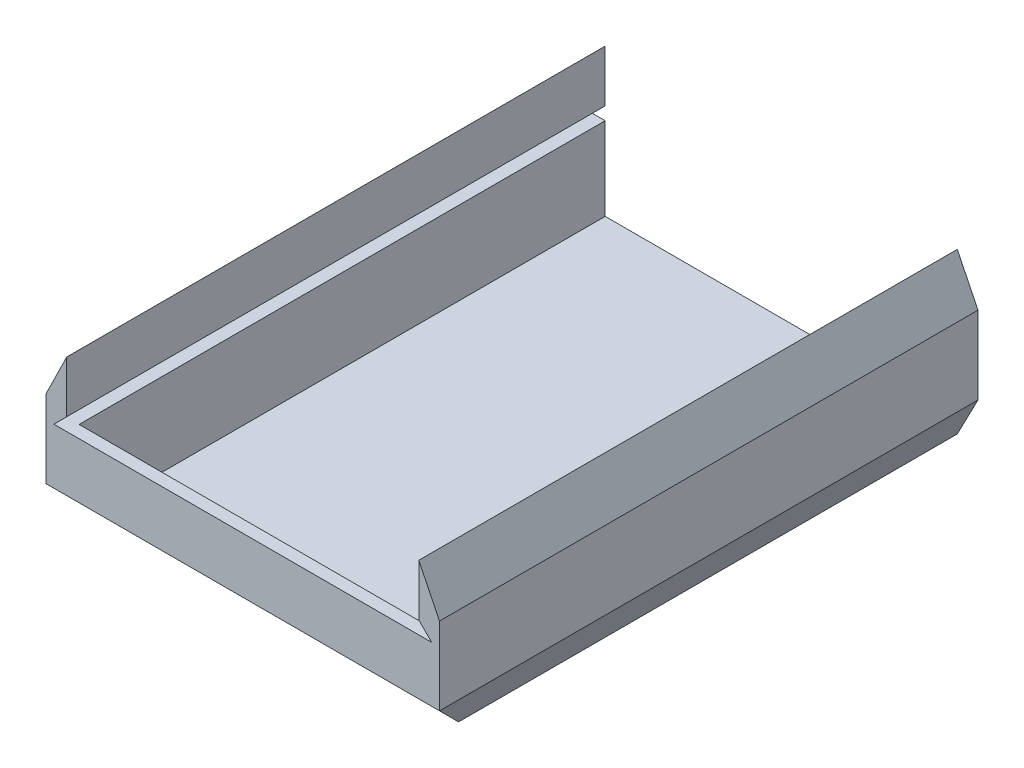
ISO-10303-21;
HEADER;
FILE_DESCRIPTION(('STEP AP214'),'2;1');
FILE_NAME('part.step','',(''),(''),'','','');
FILE_SCHEMA(('AUTOMOTIVE_DESIGN { 1 0 10303 214 1 1 1 1 }'));
ENDSEC;
DATA;
#1=APPLICATION_CONTEXT('core data for automotive mechanical design processes');
#2=APPLICATION_PROTOCOL_DEFINITION('international standard','automotive_design',2000,#1);
#3=PRODUCT_CONTEXT('',#1,'mechanical');
#4=PRODUCT('Part','Part','',(#3));
#5=PRODUCT_RELATED_PRODUCT_CATEGORY('part','',(#4));
#6=PRODUCT_DEFINITION_FORMATION('','',#4);
#7=PRODUCT_DEFINITION_CONTEXT('part definition',#1,'design');
#8=PRODUCT_DEFINITION('design','',#6,#7);
#9=PRODUCT_DEFINITION_SHAPE('','',#8);
#10=(LENGTH_UNIT() NAMED_UNIT(*) SI_UNIT(.MILLI.,.METRE.));
#11=(NAMED_UNIT(*) PLANE_ANGLE_UNIT() SI_UNIT($,.RADIAN.));
#12=(NAMED_UNIT(*) SI_UNIT($,.STERADIAN.) SOLID_ANGLE_UNIT());
#13=UNCERTAINTY_MEASURE_WITH_UNIT(LENGTH_MEASURE(1.E-05),#10,'distance_accuracy_value','');
#14=(GEOMETRIC_REPRESENTATION_CONTEXT(3) GLOBAL_UNCERTAINTY_ASSIGNED_CONTEXT((#13)) GLOBAL_UNIT_ASSIGNED_CONTEXT((#10,
#11,#12)) REPRESENTATION_CONTEXT('',''));
#15=CARTESIAN_POINT('',(0.,0.,0.));
#16=DIRECTION('',(0.,0.,1.));
#17=DIRECTION('',(1.,0.,0.));
#18=AXIS2_PLACEMENT_3D('',#15,#16,#17);
#19=CARTESIAN_POINT('',(0.,38.,-130.));
#20=DIRECTION('',(1.,0.,0.));
#21=DIRECTION('',(0.,1.,0.));
#22=AXIS2_PLACEMENT_3D('',#19,#20,#21);
#23=PLANE('',#22);
#24=DIRECTION('',(0.,-1.,0.));
#25=VECTOR('',#24,1.);
#26=CARTESIAN_POINT('',(0.,23.,-3.));
#27=LINE('',#26,#25);
#28=CARTESIAN_POINT('',(0.,23.,-3.));
#29=VERTEX_POINT('',#28);
#30=CARTESIAN_POINT('',(0.,8.,-3.));
#31=VERTEX_POINT('',#30);
#32=EDGE_CURVE('E195',#29,#31,#27,.T.);
#33=ORIENTED_EDGE('',*,*,#32,.T.);
#34=DIRECTION('',(0.,0.707106781186545,0.70710678118655));
#35=VECTOR('',#34,1.);
#36=CARTESIAN_POINT('',(0.,-40.5000000000001,-51.5000000000005));
#37=LINE('',#36,#35);
#38=CARTESIAN_POINT('',(0.,3.,-8.00000000000004));
#39=VERTEX_POINT('',#38);
#40=EDGE_CURVE('E11',#31,#39,#37,.F.);
#41=ORIENTED_EDGE('',*,*,#40,.T.);
#42=DIRECTION('',(0.,0.,1.));
#43=VECTOR('',#42,1.);
#44=CARTESIAN_POINT('',(0.,3.,0.));
#45=LINE('',#44,#43);
#46=CARTESIAN_POINT('',(0.,3.,-130.));
#47=VERTEX_POINT('',#46);
#48=EDGE_CURVE('E265',#47,#39,#45,.T.);
#49=ORIENTED_EDGE('',*,*,#48,.F.);
#50=DIRECTION('',(0.,1.,0.));
#51=VECTOR('',#50,1.);
#52=CARTESIAN_POINT('',(0.,38.,-130.));
#53=LINE('',#52,#51);
#54=CARTESIAN_POINT('',(0.,23.,-130.));
#55=VERTEX_POINT('',#54);
#56=EDGE_CURVE('E249',#47,#55,#53,.T.);
#57=ORIENTED_EDGE('',*,*,#56,.T.);
#58=DIRECTION('',(0.,0.,1.));
#59=VECTOR('',#58,1.);
#60=CARTESIAN_POINT('',(0.,23.,-130.));
#61=LINE('',#60,#59);
#62=EDGE_CURVE('E210',#55,#29,#61,.T.);
#63=ORIENTED_EDGE('',*,*,#62,.T.);
#64=EDGE_LOOP('',(#33,#41,#49,#57,#63));
#65=FACE_BOUND('',#64,.T.);
#66=ADVANCED_FACE('F33',(#65),#23,.T.);
#67=CARTESIAN_POINT('',(0.,3.,0.));
#68=DIRECTION('',(0.,-1.,0.));
#69=DIRECTION('',(0.,0.,-1.));
#70=AXIS2_PLACEMENT_3D('',#67,#68,#69);
#71=PLANE('',#70);
#72=ORIENTED_EDGE('',*,*,#48,.T.);
#73=DIRECTION('',(1.,0.,0.));
#74=VECTOR('',#73,1.);
#75=CARTESIAN_POINT('',(85.,3.,-8.00000000000004));
#76=LINE('',#75,#74);
#77=CARTESIAN_POINT('',(85.,3.,-8.00000000000004));
#78=VERTEX_POINT('',#77);
#79=EDGE_CURVE('E293',#39,#78,#76,.T.);
#80=ORIENTED_EDGE('',*,*,#79,.T.);
#81=DIRECTION('',(0.,0.,-1.));
#82=VECTOR('',#81,1.);
#83=CARTESIAN_POINT('',(85.,3.,0.));
#84=LINE('',#83,#82);
#85=CARTESIAN_POINT('',(85.,3.,-130.));
#86=VERTEX_POINT('',#85);
#87=EDGE_CURVE('E268',#78,#86,#84,.T.);
#88=ORIENTED_EDGE('',*,*,#87,.T.);
#89=DIRECTION('',(-1.,0.,0.));
#90=VECTOR('',#89,1.);
#91=CARTESIAN_POINT('',(0.,3.,-130.));
#92=LINE('',#91,#90);
#93=EDGE_CURVE('E271',#86,#47,#92,.T.);
#94=ORIENTED_EDGE('',*,*,#93,.T.);
#95=EDGE_LOOP('',(#72,#80,#88,#94));
#96=FACE_BOUND('',#95,.T.);
#97=ADVANCED_FACE('F298',(#96),#71,.F.);
#98=CARTESIAN_POINT('',(85.,38.,-130.));
#99=DIRECTION('',(-1.,0.,0.));
#100=DIRECTION('',(0.,0.,1.));
#101=AXIS2_PLACEMENT_3D('',#98,#99,#100);
#102=PLANE('',#101);
#103=ORIENTED_EDGE('',*,*,#87,.F.);
#104=DIRECTION('',(0.,-0.707106781186545,-0.70710678118655));
#105=VECTOR('',#104,1.);
#106=CARTESIAN_POINT('',(85.,-40.5000000000001,-51.5000000000005));
#107=LINE('',#106,#105);
#108=CARTESIAN_POINT('',(85.,8.,-3.));
#109=VERTEX_POINT('',#108);
#110=EDGE_CURVE('E55',#78,#109,#107,.F.);
#111=ORIENTED_EDGE('',*,*,#110,.T.);
#112=DIRECTION('',(0.,1.,0.));
#113=VECTOR('',#112,1.);
#114=CARTESIAN_POINT('',(85.,23.,-3.));
#115=LINE('',#114,#113);
#116=CARTESIAN_POINT('',(85.,23.,-3.));
#117=VERTEX_POINT('',#116);
#118=EDGE_CURVE('E197',#109,#117,#115,.T.);
#119=ORIENTED_EDGE('',*,*,#118,.T.);
#120=DIRECTION('',(0.,0.,1.));
#121=VECTOR('',#120,1.);
#122=CARTESIAN_POINT('',(85.,23.,-130.));
#123=LINE('',#122,#121);
#124=CARTESIAN_POINT('',(85.,23.,-130.));
#125=VERTEX_POINT('',#124);
#126=EDGE_CURVE('E225',#125,#117,#123,.T.);
#127=ORIENTED_EDGE('',*,*,#126,.F.);
#128=DIRECTION('',(0.,-1.,0.));
#129=VECTOR('',#128,1.);
#130=CARTESIAN_POINT('',(85.,38.,-130.));
#131=LINE('',#130,#129);
#132=EDGE_CURVE('E171',#125,#86,#131,.T.);
#133=ORIENTED_EDGE('',*,*,#132,.T.);
#134=EDGE_LOOP('',(#103,#111,#119,#127,#133));
#135=FACE_BOUND('',#134,.T.);
#136=ADVANCED_FACE('F302',(#135),#102,.T.);
#137=DIRECTION('',(0.,0.,1.));
#138=VECTOR('',#137,1.);
#139=CARTESIAN_POINT('',(85.,26.1,-130.));
#140=LINE('',#139,#138);
#141=CARTESIAN_POINT('',(85.,26.1,-130.));
#142=VERTEX_POINT('',#141);
#143=CARTESIAN_POINT('',(85.,26.1,0.));
#144=VERTEX_POINT('',#143);
#145=EDGE_CURVE('E213',#142,#144,#140,.T.);
#146=ORIENTED_EDGE('',*,*,#145,.T.);
#147=DIRECTION('',(0.,-1.,0.));
#148=VECTOR('',#147,1.);
#149=CARTESIAN_POINT('',(85.,38.,0.));
#150=LINE('',#149,#148);
#151=CARTESIAN_POINT('',(85.,38.6,0.));
#152=VERTEX_POINT('',#151);
#153=EDGE_CURVE('E177',#152,#144,#150,.T.);
#154=ORIENTED_EDGE('',*,*,#153,.F.);
#155=DIRECTION('',(0.,0.,1.));
#156=VECTOR('',#155,1.);
#157=CARTESIAN_POINT('',(85.,38.6,-130.));
#158=LINE('',#157,#156);
#159=CARTESIAN_POINT('',(85.,38.6,-130.));
#160=VERTEX_POINT('',#159);
#161=EDGE_CURVE('E174',#160,#152,#158,.T.);
#162=ORIENTED_EDGE('',*,*,#161,.F.);
#163=EDGE_CURVE('E158',#160,#142,#131,.T.);
#164=ORIENTED_EDGE('',*,*,#163,.T.);
#165=EDGE_LOOP('',(#146,#154,#162,#164));
#166=FACE_BOUND('',#165,.T.);
#167=ADVANCED_FACE('F175',(#166),#102,.T.);
#168=CARTESIAN_POINT('',(0.,3.,0.));
#169=DIRECTION('',(0.,0.,-1.));
#170=DIRECTION('',(-1.,0.,0.));
#171=AXIS2_PLACEMENT_3D('',#168,#169,#170);
#172=PLANE('',#171);
#173=DIRECTION('',(0.,1.,0.));
#174=VECTOR('',#173,1.);
#175=CARTESIAN_POINT('',(90.,9.60906334512409,0.));
#176=LINE('',#175,#174);
#177=CARTESIAN_POINT('',(90.,9.60999999999998,0.));
#178=VERTEX_POINT('',#177);
#179=CARTESIAN_POINT('',(90.,28.3909366548759,0.));
#180=VERTEX_POINT('',#179);
#181=EDGE_CURVE('E218',#178,#180,#176,.T.);
#182=ORIENTED_EDGE('',*,*,#181,.T.);
#183=DIRECTION('',(-0.439842080698515,0.898075132740464,0.));
#184=VECTOR('',#183,1.);
#185=CARTESIAN_POINT('',(85.,38.6,0.));
#186=LINE('',#185,#184);
#187=EDGE_CURVE('E185',#180,#152,#186,.T.);
#188=ORIENTED_EDGE('',*,*,#187,.T.);
#189=ORIENTED_EDGE('',*,*,#153,.T.);
#190=DIRECTION('',(-0.707106781186547,0.707106781186548,0.));
#191=VECTOR('',#190,1.);
#192=CARTESIAN_POINT('',(88.1,23.,0.));
#193=LINE('',#192,#191);
#194=CARTESIAN_POINT('',(88.1,23.,0.));
#195=VERTEX_POINT('',#194);
#196=EDGE_CURVE('E202',#195,#144,#193,.T.);
#197=ORIENTED_EDGE('',*,*,#196,.F.);
#198=DIRECTION('',(1.,0.,0.));
#199=VECTOR('',#198,1.);
#200=CARTESIAN_POINT('',(0.,23.,0.));
#201=LINE('',#200,#199);
#202=CARTESIAN_POINT('',(-3.1,23.,0.));
#203=VERTEX_POINT('',#202);
#204=EDGE_CURVE('E211',#203,#195,#201,.T.);
#205=ORIENTED_EDGE('',*,*,#204,.F.);
#206=DIRECTION('',(-0.707106781186548,-0.707106781186547,0.));
#207=VECTOR('',#206,1.);
#208=CARTESIAN_POINT('',(-3.1,23.,0.));
#209=LINE('',#208,#207);
#210=CARTESIAN_POINT('',(0.,26.1,0.));
#211=VERTEX_POINT('',#210);
#212=EDGE_CURVE('E207',#211,#203,#209,.T.);
#213=ORIENTED_EDGE('',*,*,#212,.F.);
#214=DIRECTION('',(0.,1.,0.));
#215=VECTOR('',#214,1.);
#216=CARTESIAN_POINT('',(0.,38.,0.));
#217=LINE('',#216,#215);
#218=CARTESIAN_POINT('',(0.,38.6,0.));
#219=VERTEX_POINT('',#218);
#220=EDGE_CURVE('E242',#211,#219,#217,.T.);
#221=ORIENTED_EDGE('',*,*,#220,.T.);
#222=DIRECTION('',(-0.439842080698515,-0.898075132740464,0.));
#223=VECTOR('',#222,1.);
#224=CARTESIAN_POINT('',(0.,38.6,0.));
#225=LINE('',#224,#223);
#226=CARTESIAN_POINT('',(-5.,28.3909366548759,0.));
#227=VERTEX_POINT('',#226);
#228=EDGE_CURVE('E180',#219,#227,#225,.T.);
#229=ORIENTED_EDGE('',*,*,#228,.T.);
#230=DIRECTION('',(0.,-1.,0.));
#231=VECTOR('',#230,1.);
#232=CARTESIAN_POINT('',(-5.,9.60906334512409,0.));
#233=LINE('',#232,#231);
#234=CARTESIAN_POINT('',(-5.,9.60999999999998,0.));
#235=VERTEX_POINT('',#234);
#236=EDGE_CURVE('E248',#227,#235,#233,.T.);
#237=ORIENTED_EDGE('',*,*,#236,.T.);
#238=DIRECTION('',(1.,0.,0.));
#239=VECTOR('',#238,1.);
#240=CARTESIAN_POINT('',(85.,9.60999999999998,0.));
#241=LINE('',#240,#239);
#242=EDGE_CURVE('E274',#235,#178,#241,.T.);
#243=ORIENTED_EDGE('',*,*,#242,.T.);
#244=EDGE_LOOP('',(#182,#188,#189,#197,#205,#213,#221,#229,#237,#243));
#245=FACE_BOUND('',#244,.T.);
#246=ADVANCED_FACE('F359',(#245),#172,.F.);
#247=CARTESIAN_POINT('',(0.,3.,-130.));
#248=DIRECTION('',(0.,0.,1.));
#249=DIRECTION('',(1.,0.,0.));
#250=AXIS2_PLACEMENT_3D('',#247,#248,#249);
#251=PLANE('',#250);
#252=DIRECTION('',(-0.707106781186547,0.707106781186548,0.));
#253=VECTOR('',#252,1.);
#254=CARTESIAN_POINT('',(88.1,23.,-130.));
#255=LINE('',#254,#253);
#256=CARTESIAN_POINT('',(88.1,23.,-130.));
#257=VERTEX_POINT('',#256);
#258=EDGE_CURVE('E167',#257,#142,#255,.T.);
#259=ORIENTED_EDGE('',*,*,#258,.T.);
#260=ORIENTED_EDGE('',*,*,#163,.F.);
#261=DIRECTION('',(-0.439842080698515,0.898075132740464,0.));
#262=VECTOR('',#261,1.);
#263=CARTESIAN_POINT('',(85.,38.6,-130.));
#264=LINE('',#263,#262);
#265=CARTESIAN_POINT('',(90.,28.3909366548759,-130.));
#266=VERTEX_POINT('',#265);
#267=EDGE_CURVE('E163',#266,#160,#264,.T.);
#268=ORIENTED_EDGE('',*,*,#267,.F.);
#269=DIRECTION('',(0.,1.,0.));
#270=VECTOR('',#269,1.);
#271=CARTESIAN_POINT('',(90.,9.60906334512409,-130.));
#272=LINE('',#271,#270);
#273=CARTESIAN_POINT('',(90.,9.60906334512409,-130.));
#274=VERTEX_POINT('',#273);
#275=EDGE_CURVE('E236',#274,#266,#272,.T.);
#276=ORIENTED_EDGE('',*,*,#275,.F.);
#277=DIRECTION('',(0.461591586339288,0.887092558542106,0.));
#278=VECTOR('',#277,1.);
#279=CARTESIAN_POINT('',(85.,0.,-130.));
#280=LINE('',#279,#278);
#281=CARTESIAN_POINT('',(85.,0.,-130.));
#282=VERTEX_POINT('',#281);
#283=EDGE_CURVE('E233',#282,#274,#280,.T.);
#284=ORIENTED_EDGE('',*,*,#283,.F.);
#285=DIRECTION('',(-1.,0.,0.));
#286=VECTOR('',#285,1.);
#287=CARTESIAN_POINT('',(0.,0.,-130.));
#288=LINE('',#287,#286);
#289=CARTESIAN_POINT('',(0.,0.,-130.));
#290=VERTEX_POINT('',#289);
#291=EDGE_CURVE('E269',#282,#290,#288,.T.);
#292=ORIENTED_EDGE('',*,*,#291,.T.);
#293=DIRECTION('',(0.461591586339287,-0.887092558542106,0.));
#294=VECTOR('',#293,1.);
#295=CARTESIAN_POINT('',(0.,0.,-130.));
#296=LINE('',#295,#294);
#297=CARTESIAN_POINT('',(-5.,9.60906334512409,-130.));
#298=VERTEX_POINT('',#297);
#299=EDGE_CURVE('E245',#298,#290,#296,.T.);
#300=ORIENTED_EDGE('',*,*,#299,.F.);
#301=DIRECTION('',(0.,-1.,0.));
#302=VECTOR('',#301,1.);
#303=CARTESIAN_POINT('',(-5.,9.60906334512409,-130.));
#304=LINE('',#303,#302);
#305=CARTESIAN_POINT('',(-5.,28.3909366548759,-130.));
#306=VERTEX_POINT('',#305);
#307=EDGE_CURVE('E252',#306,#298,#304,.T.);
#308=ORIENTED_EDGE('',*,*,#307,.F.);
#309=DIRECTION('',(-0.439842080698515,-0.898075132740464,0.));
#310=VECTOR('',#309,1.);
#311=CARTESIAN_POINT('',(0.,38.6,-130.));
#312=LINE('',#311,#310);
#313=CARTESIAN_POINT('',(0.,38.6,-130.));
#314=VERTEX_POINT('',#313);
#315=EDGE_CURVE('E189',#314,#306,#312,.T.);
#316=ORIENTED_EDGE('',*,*,#315,.F.);
#317=CARTESIAN_POINT('',(0.,26.1,-130.));
#318=VERTEX_POINT('',#317);
#319=EDGE_CURVE('E247',#318,#314,#53,.T.);
#320=ORIENTED_EDGE('',*,*,#319,.F.);
#321=DIRECTION('',(-0.707106781186548,-0.707106781186547,0.));
#322=VECTOR('',#321,1.);
#323=CARTESIAN_POINT('',(-3.1,23.,-130.));
#324=LINE('',#323,#322);
#325=CARTESIAN_POINT('',(-3.1,23.,-130.));
#326=VERTEX_POINT('',#325);
#327=EDGE_CURVE('E206',#318,#326,#324,.T.);
#328=ORIENTED_EDGE('',*,*,#327,.T.);
#329=DIRECTION('',(1.,0.,0.));
#330=VECTOR('',#329,1.);
#331=CARTESIAN_POINT('',(0.,23.,-130.));
#332=LINE('',#331,#330);
#333=EDGE_CURVE('E203',#326,#55,#332,.T.);
#334=ORIENTED_EDGE('',*,*,#333,.T.);
#335=ORIENTED_EDGE('',*,*,#56,.F.);
#336=ORIENTED_EDGE('',*,*,#93,.F.);
#337=ORIENTED_EDGE('',*,*,#132,.F.);
#338=DIRECTION('',(1.,0.,0.));
#339=VECTOR('',#338,1.);
#340=CARTESIAN_POINT('',(85.,23.,-130.));
#341=LINE('',#340,#339);
#342=EDGE_CURVE('E222',#125,#257,#341,.T.);
#343=ORIENTED_EDGE('',*,*,#342,.T.);
#344=EDGE_LOOP('',(#259,#260,#268,#276,#284,#292,#300,#308,#316,#320,#328,#334,#335,#336,#337,#343));
#345=FACE_BOUND('',#344,.T.);
#346=ADVANCED_FACE('F160',(#345),#251,.F.);
#347=CARTESIAN_POINT('',(0.,0.,0.));
#348=DIRECTION('',(0.,-1.,0.));
#349=DIRECTION('',(0.,0.,-1.));
#350=AXIS2_PLACEMENT_3D('',#347,#348,#349);
#351=PLANE('',#350);
#352=DIRECTION('',(0.,0.,-1.));
#353=VECTOR('',#352,1.);
#354=CARTESIAN_POINT('',(85.,0.,0.));
#355=LINE('',#354,#353);
#356=CARTESIAN_POINT('',(85.,0.,-9.61000000000001));
#357=VERTEX_POINT('',#356);
#358=EDGE_CURVE('E277',#357,#282,#355,.T.);
#359=ORIENTED_EDGE('',*,*,#358,.F.);
#360=DIRECTION('',(-1.,0.,0.));
#361=VECTOR('',#360,1.);
#362=CARTESIAN_POINT('',(0.,0.,-9.61000000000001));
#363=LINE('',#362,#361);
#364=CARTESIAN_POINT('',(0.,0.,-9.61000000000001));
#365=VERTEX_POINT('',#364);
#366=EDGE_CURVE('E287',#357,#365,#363,.T.);
#367=ORIENTED_EDGE('',*,*,#366,.T.);
#368=DIRECTION('',(0.,0.,1.));
#369=VECTOR('',#368,1.);
#370=CARTESIAN_POINT('',(0.,0.,0.));
#371=LINE('',#370,#369);
#372=EDGE_CURVE('E262',#290,#365,#371,.T.);
#373=ORIENTED_EDGE('',*,*,#372,.F.);
#374=ORIENTED_EDGE('',*,*,#291,.F.);
#375=EDGE_LOOP('',(#359,#367,#373,#374));
#376=FACE_BOUND('',#375,.T.);
#377=ADVANCED_FACE('F332',(#376),#351,.T.);
#378=DIRECTION('',(0.,0.,1.));
#379=VECTOR('',#378,1.);
#380=CARTESIAN_POINT('',(0.,26.1,-130.));
#381=LINE('',#380,#379);
#382=EDGE_CURVE('E219',#318,#211,#381,.T.);
#383=ORIENTED_EDGE('',*,*,#382,.F.);
#384=ORIENTED_EDGE('',*,*,#319,.T.);
#385=DIRECTION('',(0.,0.,1.));
#386=VECTOR('',#385,1.);
#387=CARTESIAN_POINT('',(0.,38.6,-130.));
#388=LINE('',#387,#386);
#389=EDGE_CURVE('E191',#314,#219,#388,.T.);
#390=ORIENTED_EDGE('',*,*,#389,.T.);
#391=ORIENTED_EDGE('',*,*,#220,.F.);
#392=EDGE_LOOP('',(#383,#384,#390,#391));
#393=FACE_BOUND('',#392,.T.);
#394=ADVANCED_FACE('F323',(#393),#23,.T.);
#395=CARTESIAN_POINT('',(0.,0.,-130.));
#396=DIRECTION('',(-0.887092558542106,-0.461591586339287,0.));
#397=DIRECTION('',(0.461591586339287,-0.887092558542106,0.));
#398=AXIS2_PLACEMENT_3D('',#395,#396,#397);
#399=PLANE('',#398);
#400=ORIENTED_EDGE('',*,*,#372,.T.);
#401=DIRECTION('',(-0.3453056816789,0.663612833736761,0.663612833736763));
#402=VECTOR('',#401,1.);
#403=CARTESIAN_POINT('',(27.5872820508712,-53.0175881493253,-62.6275881493254));
#404=LINE('',#403,#402);
#405=CARTESIAN_POINT('',(-5.,9.60906334512409,-0.000936654875882681));
#406=VERTEX_POINT('',#405);
#407=EDGE_CURVE('E289',#365,#406,#404,.T.);
#408=ORIENTED_EDGE('',*,*,#407,.T.);
#409=DIRECTION('',(0.,0.,1.));
#410=VECTOR('',#409,1.);
#411=CARTESIAN_POINT('',(-5.,9.60906334512409,-130.));
#412=LINE('',#411,#410);
#413=EDGE_CURVE('E259',#298,#406,#412,.T.);
#414=ORIENTED_EDGE('',*,*,#413,.F.);
#415=ORIENTED_EDGE('',*,*,#299,.T.);
#416=EDGE_LOOP('',(#400,#408,#414,#415));
#417=FACE_BOUND('',#416,.T.);
#418=ADVANCED_FACE('F331',(#417),#399,.T.);
#419=CARTESIAN_POINT('',(-5.,9.60906334512409,-130.));
#420=DIRECTION('',(-1.,0.,0.));
#421=DIRECTION('',(0.,-1.,0.));
#422=AXIS2_PLACEMENT_3D('',#419,#420,#421);
#423=PLANE('',#422);
#424=ORIENTED_EDGE('',*,*,#413,.T.);
#425=DIRECTION('',(0.,0.707106781186547,0.707106781186549));
#426=VECTOR('',#425,1.);
#427=CARTESIAN_POINT('',(-4.99999999999999,-55.390468327438,-65.0004683274381));
#428=LINE('',#427,#426);
#429=EDGE_CURVE('E291',#406,#235,#428,.T.);
#430=ORIENTED_EDGE('',*,*,#429,.T.);
#431=ORIENTED_EDGE('',*,*,#236,.F.);
#432=DIRECTION('',(0.,0.,1.));
#433=VECTOR('',#432,1.);
#434=CARTESIAN_POINT('',(-5.,28.3909366548759,-130.));
#435=LINE('',#434,#433);
#436=EDGE_CURVE('E255',#306,#227,#435,.T.);
#437=ORIENTED_EDGE('',*,*,#436,.F.);
#438=ORIENTED_EDGE('',*,*,#307,.T.);
#439=EDGE_LOOP('',(#424,#430,#431,#437,#438));
#440=FACE_BOUND('',#439,.T.);
#441=ADVANCED_FACE('F338',(#440),#423,.T.);
#442=CARTESIAN_POINT('',(85.,0.,-130.));
#443=DIRECTION('',(0.887092558542106,-0.461591586339288,0.));
#444=DIRECTION('',(0.461591586339288,0.887092558542106,0.));
#445=AXIS2_PLACEMENT_3D('',#442,#443,#444);
#446=PLANE('',#445);
#447=DIRECTION('',(0.,0.,1.));
#448=VECTOR('',#447,1.);
#449=CARTESIAN_POINT('',(90.,9.60906334512409,-130.));
#450=LINE('',#449,#448);
#451=CARTESIAN_POINT('',(90.,9.60906334512409,-0.000936654875882681));
#452=VERTEX_POINT('',#451);
#453=EDGE_CURVE('E170',#274,#452,#450,.T.);
#454=ORIENTED_EDGE('',*,*,#453,.T.);
#455=DIRECTION('',(-0.3453056816789,-0.663612833736761,-0.663612833736763));
#456=VECTOR('',#455,1.);
#457=CARTESIAN_POINT('',(57.4127179491288,-53.0175881493252,-62.6275881493254));
#458=LINE('',#457,#456);
#459=EDGE_CURVE('E285',#452,#357,#458,.T.);
#460=ORIENTED_EDGE('',*,*,#459,.T.);
#461=ORIENTED_EDGE('',*,*,#358,.T.);
#462=ORIENTED_EDGE('',*,*,#283,.T.);
#463=EDGE_LOOP('',(#454,#460,#461,#462));
#464=FACE_BOUND('',#463,.T.);
#465=ADVANCED_FACE('F367',(#464),#446,.T.);
#466=CARTESIAN_POINT('',(90.,9.60906334512409,-130.));
#467=DIRECTION('',(1.,0.,0.));
#468=DIRECTION('',(0.,0.,-1.));
#469=AXIS2_PLACEMENT_3D('',#466,#467,#468);
#470=PLANE('',#469);
#471=ORIENTED_EDGE('',*,*,#181,.F.);
#472=DIRECTION('',(0.,-0.707106781186547,-0.707106781186549));
#473=VECTOR('',#472,1.);
#474=CARTESIAN_POINT('',(90.,-55.390468327438,-65.0004683274381));
#475=LINE('',#474,#473);
#476=EDGE_CURVE('E283',#178,#452,#475,.T.);
#477=ORIENTED_EDGE('',*,*,#476,.T.);
#478=ORIENTED_EDGE('',*,*,#453,.F.);
#479=ORIENTED_EDGE('',*,*,#275,.T.);
#480=DIRECTION('',(0.,0.,1.));
#481=VECTOR('',#480,1.);
#482=CARTESIAN_POINT('',(90.,28.3909366548759,-130.));
#483=LINE('',#482,#481);
#484=EDGE_CURVE('E184',#266,#180,#483,.T.);
#485=ORIENTED_EDGE('',*,*,#484,.T.);
#486=EDGE_LOOP('',(#471,#477,#478,#479,#485));
#487=FACE_BOUND('',#486,.T.);
#488=ADVANCED_FACE('F365',(#487),#470,.T.);
#489=CARTESIAN_POINT('',(88.1,23.,-130.));
#490=DIRECTION('',(0.707106781186548,0.707106781186547,0.));
#491=DIRECTION('',(-0.707106781186547,0.707106781186548,0.));
#492=AXIS2_PLACEMENT_3D('',#489,#490,#491);
#493=PLANE('',#492);
#494=ORIENTED_EDGE('',*,*,#196,.T.);
#495=ORIENTED_EDGE('',*,*,#145,.F.);
#496=ORIENTED_EDGE('',*,*,#258,.F.);
#497=DIRECTION('',(0.,0.,1.));
#498=VECTOR('',#497,1.);
#499=CARTESIAN_POINT('',(88.1,23.,-130.));
#500=LINE('',#499,#498);
#501=EDGE_CURVE('E228',#257,#195,#500,.T.);
#502=ORIENTED_EDGE('',*,*,#501,.T.);
#503=EDGE_LOOP('',(#494,#495,#496,#502));
#504=FACE_BOUND('',#503,.T.);
#505=ADVANCED_FACE('F379',(#504),#493,.F.);
#506=CARTESIAN_POINT('',(0.,23.,-130.));
#507=DIRECTION('',(0.,-1.,0.));
#508=DIRECTION('',(0.,0.,-1.));
#509=AXIS2_PLACEMENT_3D('',#506,#507,#508);
#510=PLANE('',#509);
#511=ORIENTED_EDGE('',*,*,#204,.T.);
#512=ORIENTED_EDGE('',*,*,#501,.F.);
#513=ORIENTED_EDGE('',*,*,#342,.F.);
#514=ORIENTED_EDGE('',*,*,#126,.T.);
#515=DIRECTION('',(-1.,0.,0.));
#516=VECTOR('',#515,1.);
#517=CARTESIAN_POINT('',(0.,23.,-3.));
#518=LINE('',#517,#516);
#519=EDGE_CURVE('E199',#117,#29,#518,.T.);
#520=ORIENTED_EDGE('',*,*,#519,.T.);
#521=ORIENTED_EDGE('',*,*,#62,.F.);
#522=ORIENTED_EDGE('',*,*,#333,.F.);
#523=DIRECTION('',(0.,0.,1.));
#524=VECTOR('',#523,1.);
#525=CARTESIAN_POINT('',(-3.1,23.,-130.));
#526=LINE('',#525,#524);
#527=EDGE_CURVE('E216',#326,#203,#526,.T.);
#528=ORIENTED_EDGE('',*,*,#527,.T.);
#529=EDGE_LOOP('',(#511,#512,#513,#514,#520,#521,#522,#528));
#530=FACE_BOUND('',#529,.T.);
#531=ADVANCED_FACE('F387',(#530),#510,.F.);
#532=CARTESIAN_POINT('',(-3.1,23.,-130.));
#533=DIRECTION('',(-0.707106781186547,0.707106781186548,0.));
#534=DIRECTION('',(-0.707106781186548,-0.707106781186547,0.));
#535=AXIS2_PLACEMENT_3D('',#532,#533,#534);
#536=PLANE('',#535);
#537=ORIENTED_EDGE('',*,*,#212,.T.);
#538=ORIENTED_EDGE('',*,*,#527,.F.);
#539=ORIENTED_EDGE('',*,*,#327,.F.);
#540=ORIENTED_EDGE('',*,*,#382,.T.);
#541=EDGE_LOOP('',(#537,#538,#539,#540));
#542=FACE_BOUND('',#541,.T.);
#543=ADVANCED_FACE('F391',(#542),#536,.F.);
#544=CARTESIAN_POINT('',(0.,0.,-3.));
#545=DIRECTION('',(0.,0.,1.));
#546=DIRECTION('',(1.,0.,0.));
#547=AXIS2_PLACEMENT_3D('',#544,#545,#546);
#548=PLANE('',#547);
#549=ORIENTED_EDGE('',*,*,#118,.F.);
#550=DIRECTION('',(-1.,0.,0.));
#551=VECTOR('',#550,1.);
#552=CARTESIAN_POINT('',(0.,8.,-3.));
#553=LINE('',#552,#551);
#554=EDGE_CURVE('E41',#109,#31,#553,.T.);
#555=ORIENTED_EDGE('',*,*,#554,.T.);
#556=ORIENTED_EDGE('',*,*,#32,.F.);
#557=ORIENTED_EDGE('',*,*,#519,.F.);
#558=EDGE_LOOP('',(#549,#555,#556,#557));
#559=FACE_BOUND('',#558,.T.);
#560=ADVANCED_FACE('F319',(#559),#548,.F.);
#561=CARTESIAN_POINT('',(0.,9.60999999999998,0.));
#562=DIRECTION('',(0.,-0.707106781186549,0.707106781186547));
#563=DIRECTION('',(-1.,0.,0.));
#564=AXIS2_PLACEMENT_3D('',#561,#562,#563);
#565=PLANE('',#564);
#566=ORIENTED_EDGE('',*,*,#407,.F.);
#567=ORIENTED_EDGE('',*,*,#366,.F.);
#568=ORIENTED_EDGE('',*,*,#459,.F.);
#569=ORIENTED_EDGE('',*,*,#476,.F.);
#570=ORIENTED_EDGE('',*,*,#242,.F.);
#571=ORIENTED_EDGE('',*,*,#429,.F.);
#572=EDGE_LOOP('',(#566,#567,#568,#569,#570,#571));
#573=FACE_BOUND('',#572,.T.);
#574=ADVANCED_FACE('F311',(#573),#565,.T.);
#575=CARTESIAN_POINT('',(0.,3.,-8.00000000000004));
#576=DIRECTION('',(0.,0.707106781186551,-0.707106781186545));
#577=DIRECTION('',(-1.,0.,0.));
#578=AXIS2_PLACEMENT_3D('',#575,#576,#577);
#579=PLANE('',#578);
#580=ORIENTED_EDGE('',*,*,#40,.F.);
#581=ORIENTED_EDGE('',*,*,#554,.F.);
#582=ORIENTED_EDGE('',*,*,#110,.F.);
#583=ORIENTED_EDGE('',*,*,#79,.F.);
#584=EDGE_LOOP('',(#580,#581,#582,#583));
#585=FACE_BOUND('',#584,.T.);
#586=ADVANCED_FACE('F35',(#585),#579,.T.);
#587=CARTESIAN_POINT('',(0.,38.6,-130.));
#588=DIRECTION('',(-0.898075132740463,0.439842080698515,0.));
#589=DIRECTION('',(-0.439842080698515,-0.898075132740464,0.));
#590=AXIS2_PLACEMENT_3D('',#587,#588,#589);
#591=PLANE('',#590);
#592=ORIENTED_EDGE('',*,*,#228,.F.);
#593=ORIENTED_EDGE('',*,*,#389,.F.);
#594=ORIENTED_EDGE('',*,*,#315,.T.);
#595=ORIENTED_EDGE('',*,*,#436,.T.);
#596=EDGE_LOOP('',(#592,#593,#594,#595));
#597=FACE_BOUND('',#596,.T.);
#598=ADVANCED_FACE('F310',(#597),#591,.T.);
#599=CARTESIAN_POINT('',(85.,38.6,-130.));
#600=DIRECTION('',(0.898075132740463,0.439842080698515,0.));
#601=DIRECTION('',(-0.439842080698515,0.898075132740464,0.));
#602=AXIS2_PLACEMENT_3D('',#599,#600,#601);
#603=PLANE('',#602);
#604=ORIENTED_EDGE('',*,*,#187,.F.);
#605=ORIENTED_EDGE('',*,*,#484,.F.);
#606=ORIENTED_EDGE('',*,*,#267,.T.);
#607=ORIENTED_EDGE('',*,*,#161,.T.);
#608=EDGE_LOOP('',(#604,#605,#606,#607));
#609=FACE_BOUND('',#608,.T.);
#610=ADVANCED_FACE('F182',(#609),#603,.T.);
#611=CLOSED_SHELL('',(#66,#97,#136,#167,#246,#346,#377,#394,#418,#441,#465,#488,#505,#531,#543,
#560,#574,#586,#598,#610));
#612=MANIFOLD_SOLID_BREP('B2',#611);
#613=ADVANCED_BREP_SHAPE_REPRESENTATION('',(#18,#612),#14);
#614=SHAPE_DEFINITION_REPRESENTATION(#9,#613);
ENDSEC;
END-ISO-10303-21;
